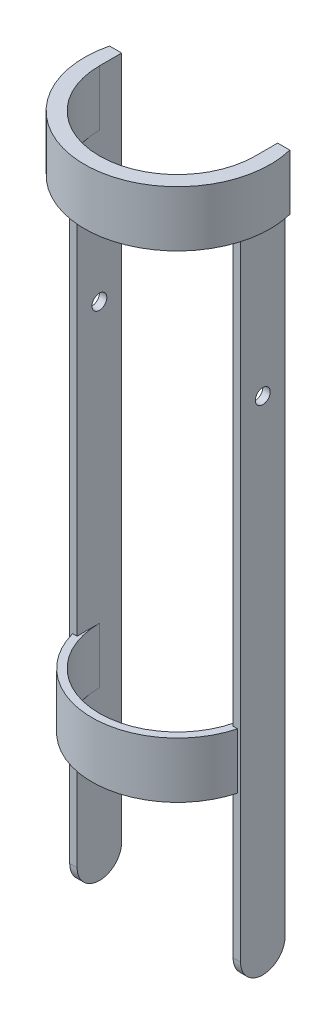
ISO-10303-21;
HEADER;
FILE_DESCRIPTION(('STEP AP214'),'2;1');
FILE_NAME('part.step','',(''),(''),'','','');
FILE_SCHEMA(('AUTOMOTIVE_DESIGN { 1 0 10303 214 1 1 1 1 }'));
ENDSEC;
DATA;
#1=APPLICATION_CONTEXT('core data for automotive mechanical design processes');
#2=APPLICATION_PROTOCOL_DEFINITION('international standard','automotive_design',2000,#1);
#3=PRODUCT_CONTEXT('',#1,'mechanical');
#4=PRODUCT('Part','Part','',(#3));
#5=PRODUCT_RELATED_PRODUCT_CATEGORY('part','',(#4));
#6=PRODUCT_DEFINITION_FORMATION('','',#4);
#7=PRODUCT_DEFINITION_CONTEXT('part definition',#1,'design');
#8=PRODUCT_DEFINITION('design','',#6,#7);
#9=PRODUCT_DEFINITION_SHAPE('','',#8);
#10=(LENGTH_UNIT() NAMED_UNIT(*) SI_UNIT(.MILLI.,.METRE.));
#11=(NAMED_UNIT(*) PLANE_ANGLE_UNIT() SI_UNIT($,.RADIAN.));
#12=(NAMED_UNIT(*) SI_UNIT($,.STERADIAN.) SOLID_ANGLE_UNIT());
#13=UNCERTAINTY_MEASURE_WITH_UNIT(LENGTH_MEASURE(1.E-05),#10,'distance_accuracy_value','');
#14=(GEOMETRIC_REPRESENTATION_CONTEXT(3) GLOBAL_UNCERTAINTY_ASSIGNED_CONTEXT((#13)) GLOBAL_UNIT_ASSIGNED_CONTEXT((#10,
#11,#12)) REPRESENTATION_CONTEXT('',''));
#15=CARTESIAN_POINT('',(0.,0.,0.));
#16=DIRECTION('',(0.,0.,1.));
#17=DIRECTION('',(1.,0.,0.));
#18=AXIS2_PLACEMENT_3D('',#15,#16,#17);
#19=CARTESIAN_POINT('',(-46.,30.,0.));
#20=DIRECTION('',(1.,0.,0.));
#21=DIRECTION('',(0.,0.,-1.));
#22=AXIS2_PLACEMENT_3D('',#19,#20,#21);
#23=PLANE('',#22);
#24=CARTESIAN_POINT('',(-46.,180.,0.));
#25=DIRECTION('',(1.,0.,0.));
#26=DIRECTION('',(0.,0.,-1.));
#27=AXIS2_PLACEMENT_3D('',#24,#25,#26);
#28=CIRCLE('',#27,4.);
#29=CARTESIAN_POINT('',(-46.,180.,-4.));
#30=VERTEX_POINT('',#29);
#31=EDGE_CURVE('E209',#30,#30,#28,.T.);
#32=ORIENTED_EDGE('',*,*,#31,.T.);
#33=EDGE_LOOP('',(#32));
#34=FACE_BOUND('',#33,.T.);
#35=DIRECTION('',(0.,0.,1.));
#36=VECTOR('',#35,1.);
#37=CARTESIAN_POINT('',(-46.,260.,0.));
#38=LINE('',#37,#36);
#39=CARTESIAN_POINT('',(-46.,260.,-12.));
#40=VERTEX_POINT('',#39);
#41=CARTESIAN_POINT('',(-46.,260.,12.));
#42=VERTEX_POINT('',#41);
#43=EDGE_CURVE('E232',#40,#42,#38,.T.);
#44=ORIENTED_EDGE('',*,*,#43,.F.);
#45=DIRECTION('',(0.,-1.,0.));
#46=VECTOR('',#45,1.);
#47=CARTESIAN_POINT('',(-46.,30.,-12.));
#48=LINE('',#47,#46);
#49=CARTESIAN_POINT('',(-46.,-78.,-12.));
#50=VERTEX_POINT('',#49);
#51=EDGE_CURVE('E176',#40,#50,#48,.T.);
#52=ORIENTED_EDGE('',*,*,#51,.T.);
#53=CARTESIAN_POINT('',(-46.,-78.,0.));
#54=DIRECTION('',(-1.,0.,0.));
#55=DIRECTION('',(0.,0.,-1.));
#56=AXIS2_PLACEMENT_3D('',#53,#54,#55);
#57=CIRCLE('',#56,12.);
#58=CARTESIAN_POINT('',(-46.,-78.,12.));
#59=VERTEX_POINT('',#58);
#60=EDGE_CURVE('E273',#50,#59,#57,.T.);
#61=ORIENTED_EDGE('',*,*,#60,.T.);
#62=DIRECTION('',(0.,1.,0.));
#63=VECTOR('',#62,1.);
#64=CARTESIAN_POINT('',(-46.,-90.,12.));
#65=LINE('',#64,#63);
#66=EDGE_CURVE('E302',#59,#42,#65,.T.);
#67=ORIENTED_EDGE('',*,*,#66,.T.);
#68=EDGE_LOOP('',(#44,#52,#61,#67));
#69=FACE_BOUND('',#68,.T.);
#70=ADVANCED_FACE('F39',(#34,#69),#23,.F.);
#71=CARTESIAN_POINT('',(46.,30.,0.));
#72=DIRECTION('',(-1.,0.,0.));
#73=DIRECTION('',(0.,0.,1.));
#74=AXIS2_PLACEMENT_3D('',#71,#72,#73);
#75=PLANE('',#74);
#76=CARTESIAN_POINT('',(46.,180.,0.));
#77=DIRECTION('',(1.,0.,0.));
#78=DIRECTION('',(0.,0.,-1.));
#79=AXIS2_PLACEMENT_3D('',#76,#77,#78);
#80=CIRCLE('',#79,4.);
#81=CARTESIAN_POINT('',(46.,180.,-4.));
#82=VERTEX_POINT('',#81);
#83=EDGE_CURVE('E455',#82,#82,#80,.T.);
#84=ORIENTED_EDGE('',*,*,#83,.F.);
#85=EDGE_LOOP('',(#84));
#86=FACE_BOUND('',#85,.T.);
#87=DIRECTION('',(0.,0.,-1.));
#88=VECTOR('',#87,1.);
#89=CARTESIAN_POINT('',(46.,260.,0.));
#90=LINE('',#89,#88);
#91=CARTESIAN_POINT('',(46.,260.,12.));
#92=VERTEX_POINT('',#91);
#93=CARTESIAN_POINT('',(46.,260.,-12.));
#94=VERTEX_POINT('',#93);
#95=EDGE_CURVE('E225',#92,#94,#90,.T.);
#96=ORIENTED_EDGE('',*,*,#95,.F.);
#97=DIRECTION('',(0.,1.,0.));
#98=VECTOR('',#97,1.);
#99=CARTESIAN_POINT('',(46.,-90.,12.));
#100=LINE('',#99,#98);
#101=CARTESIAN_POINT('',(46.,-78.,12.));
#102=VERTEX_POINT('',#101);
#103=EDGE_CURVE('E293',#102,#92,#100,.T.);
#104=ORIENTED_EDGE('',*,*,#103,.F.);
#105=CARTESIAN_POINT('',(46.,-78.,0.));
#106=DIRECTION('',(-1.,0.,0.));
#107=DIRECTION('',(0.,0.,-1.));
#108=AXIS2_PLACEMENT_3D('',#105,#106,#107);
#109=CIRCLE('',#108,12.);
#110=CARTESIAN_POINT('',(46.,-78.,-12.));
#111=VERTEX_POINT('',#110);
#112=EDGE_CURVE('E272',#111,#102,#109,.T.);
#113=ORIENTED_EDGE('',*,*,#112,.F.);
#114=DIRECTION('',(0.,-1.,0.));
#115=VECTOR('',#114,1.);
#116=CARTESIAN_POINT('',(46.,30.,-12.));
#117=LINE('',#116,#115);
#118=EDGE_CURVE('E339',#94,#111,#117,.T.);
#119=ORIENTED_EDGE('',*,*,#118,.F.);
#120=EDGE_LOOP('',(#96,#104,#113,#119));
#121=FACE_BOUND('',#120,.T.);
#122=ADVANCED_FACE('F398',(#86,#121),#75,.F.);
#123=CARTESIAN_POINT('',(42.,30.,0.));
#124=DIRECTION('',(1.,0.,0.));
#125=DIRECTION('',(0.,0.,-1.));
#126=AXIS2_PLACEMENT_3D('',#123,#124,#125);
#127=PLANE('',#126);
#128=CARTESIAN_POINT('',(42.,180.,0.));
#129=DIRECTION('',(1.,0.,0.));
#130=DIRECTION('',(0.,0.,-1.));
#131=AXIS2_PLACEMENT_3D('',#128,#129,#130);
#132=CIRCLE('',#131,4.);
#133=CARTESIAN_POINT('',(42.,180.,-4.));
#134=VERTEX_POINT('',#133);
#135=EDGE_CURVE('E454',#134,#134,#132,.T.);
#136=ORIENTED_EDGE('',*,*,#135,.T.);
#137=EDGE_LOOP('',(#136));
#138=FACE_BOUND('',#137,.T.);
#139=DIRECTION('',(0.,0.,1.));
#140=VECTOR('',#139,1.);
#141=CARTESIAN_POINT('',(42.,260.,0.));
#142=LINE('',#141,#140);
#143=CARTESIAN_POINT('',(42.,260.,0.));
#144=VERTEX_POINT('',#143);
#145=CARTESIAN_POINT('',(42.,260.,12.));
#146=VERTEX_POINT('',#145);
#147=EDGE_CURVE('E216',#144,#146,#142,.T.);
#148=ORIENTED_EDGE('',*,*,#147,.F.);
#149=DIRECTION('',(0.,1.,0.));
#150=VECTOR('',#149,1.);
#151=CARTESIAN_POINT('',(42.,260.,0.));
#152=LINE('',#151,#150);
#153=CARTESIAN_POINT('',(42.,290.,0.));
#154=VERTEX_POINT('',#153);
#155=EDGE_CURVE('E217',#144,#154,#152,.T.);
#156=ORIENTED_EDGE('',*,*,#155,.T.);
#157=DIRECTION('',(0.,0.,1.));
#158=VECTOR('',#157,1.);
#159=CARTESIAN_POINT('',(42.,290.,-12.));
#160=LINE('',#159,#158);
#161=CARTESIAN_POINT('',(42.,290.,-12.));
#162=VERTEX_POINT('',#161);
#163=EDGE_CURVE('E258',#162,#154,#160,.T.);
#164=ORIENTED_EDGE('',*,*,#163,.F.);
#165=DIRECTION('',(0.,-1.,0.));
#166=VECTOR('',#165,1.);
#167=CARTESIAN_POINT('',(42.,30.,-12.));
#168=LINE('',#167,#166);
#169=CARTESIAN_POINT('',(42.,-78.,-12.));
#170=VERTEX_POINT('',#169);
#171=EDGE_CURVE('E336',#162,#170,#168,.T.);
#172=ORIENTED_EDGE('',*,*,#171,.T.);
#173=CARTESIAN_POINT('',(42.,-78.,0.));
#174=DIRECTION('',(1.,0.,0.));
#175=DIRECTION('',(0.,0.,-1.));
#176=AXIS2_PLACEMENT_3D('',#173,#174,#175);
#177=CIRCLE('',#176,12.);
#178=CARTESIAN_POINT('',(42.,-78.,12.));
#179=VERTEX_POINT('',#178);
#180=EDGE_CURVE('E283',#170,#179,#177,.F.);
#181=ORIENTED_EDGE('',*,*,#180,.T.);
#182=DIRECTION('',(0.,1.,0.));
#183=VECTOR('',#182,1.);
#184=CARTESIAN_POINT('',(42.,-90.,12.));
#185=LINE('',#184,#183);
#186=CARTESIAN_POINT('',(42.,0.,12.));
#187=VERTEX_POINT('',#186);
#188=EDGE_CURVE('E292',#179,#187,#185,.T.);
#189=ORIENTED_EDGE('',*,*,#188,.T.);
#190=DIRECTION('',(0.,0.,1.));
#191=VECTOR('',#190,1.);
#192=CARTESIAN_POINT('',(42.,0.,0.));
#193=LINE('',#192,#191);
#194=CARTESIAN_POINT('',(42.,0.,0.));
#195=VERTEX_POINT('',#194);
#196=EDGE_CURVE('E354',#195,#187,#193,.T.);
#197=ORIENTED_EDGE('',*,*,#196,.F.);
#198=DIRECTION('',(0.,-1.,0.));
#199=VECTOR('',#198,1.);
#200=CARTESIAN_POINT('',(42.,30.,0.));
#201=LINE('',#200,#199);
#202=CARTESIAN_POINT('',(42.,30.,0.));
#203=VERTEX_POINT('',#202);
#204=EDGE_CURVE('E332',#203,#195,#201,.T.);
#205=ORIENTED_EDGE('',*,*,#204,.F.);
#206=DIRECTION('',(0.,0.,1.));
#207=VECTOR('',#206,1.);
#208=CARTESIAN_POINT('',(42.,30.,-12.));
#209=LINE('',#208,#207);
#210=CARTESIAN_POINT('',(42.,30.,12.));
#211=VERTEX_POINT('',#210);
#212=EDGE_CURVE('E49',#203,#211,#209,.T.);
#213=ORIENTED_EDGE('',*,*,#212,.T.);
#214=DIRECTION('',(0.,-1.,0.));
#215=VECTOR('',#214,1.);
#216=CARTESIAN_POINT('',(42.,290.,12.));
#217=LINE('',#216,#215);
#218=EDGE_CURVE('E262',#146,#211,#217,.T.);
#219=ORIENTED_EDGE('',*,*,#218,.F.);
#220=EDGE_LOOP('',(#148,#156,#164,#172,#181,#189,#197,#205,#213,#219));
#221=FACE_BOUND('',#220,.T.);
#222=ADVANCED_FACE('F386',(#138,#221),#127,.F.);
#223=CARTESIAN_POINT('',(-46.,-90.,12.));
#224=DIRECTION('',(0.,0.,1.));
#225=DIRECTION('',(1.,0.,0.));
#226=AXIS2_PLACEMENT_3D('',#223,#224,#225);
#227=PLANE('',#226);
#228=DIRECTION('',(0.,-1.,0.));
#229=VECTOR('',#228,1.);
#230=CARTESIAN_POINT('',(-42.,290.,12.));
#231=LINE('',#230,#229);
#232=CARTESIAN_POINT('',(-42.,260.,12.));
#233=VERTEX_POINT('',#232);
#234=CARTESIAN_POINT('',(-42.,30.,12.));
#235=VERTEX_POINT('',#234);
#236=EDGE_CURVE('E56',#233,#235,#231,.T.);
#237=ORIENTED_EDGE('',*,*,#236,.F.);
#238=DIRECTION('',(-1.,0.,0.));
#239=VECTOR('',#238,1.);
#240=CARTESIAN_POINT('',(-46.,260.,12.));
#241=LINE('',#240,#239);
#242=EDGE_CURVE('E228',#233,#42,#241,.T.);
#243=ORIENTED_EDGE('',*,*,#242,.T.);
#244=ORIENTED_EDGE('',*,*,#66,.F.);
#245=DIRECTION('',(1.,0.,0.));
#246=VECTOR('',#245,1.);
#247=CARTESIAN_POINT('',(-46.,-78.,12.));
#248=LINE('',#247,#246);
#249=CARTESIAN_POINT('',(-42.,-78.,12.));
#250=VERTEX_POINT('',#249);
#251=EDGE_CURVE('E285',#59,#250,#248,.T.);
#252=ORIENTED_EDGE('',*,*,#251,.T.);
#253=DIRECTION('',(0.,1.,0.));
#254=VECTOR('',#253,1.);
#255=CARTESIAN_POINT('',(-42.,-90.,12.));
#256=LINE('',#255,#254);
#257=CARTESIAN_POINT('',(-42.,0.,12.));
#258=VERTEX_POINT('',#257);
#259=EDGE_CURVE('E303',#250,#258,#256,.T.);
#260=ORIENTED_EDGE('',*,*,#259,.T.);
#261=DIRECTION('',(1.,0.,0.));
#262=VECTOR('',#261,1.);
#263=CARTESIAN_POINT('',(0.,0.,12.));
#264=LINE('',#263,#262);
#265=CARTESIAN_POINT('',(-44.407206622349,0.,12.));
#266=VERTEX_POINT('',#265);
#267=EDGE_CURVE('E347',#266,#258,#264,.T.);
#268=ORIENTED_EDGE('',*,*,#267,.F.);
#269=DIRECTION('',(0.,-1.,0.));
#270=VECTOR('',#269,1.);
#271=CARTESIAN_POINT('',(-44.407206622349,30.,12.));
#272=LINE('',#271,#270);
#273=CARTESIAN_POINT('',(-44.407206622349,30.,12.));
#274=VERTEX_POINT('',#273);
#275=EDGE_CURVE('E306',#274,#266,#272,.T.);
#276=ORIENTED_EDGE('',*,*,#275,.F.);
#277=DIRECTION('',(1.,0.,0.));
#278=VECTOR('',#277,1.);
#279=CARTESIAN_POINT('',(-46.,30.,12.));
#280=LINE('',#279,#278);
#281=EDGE_CURVE('E238',#274,#235,#280,.T.);
#282=ORIENTED_EDGE('',*,*,#281,.T.);
#283=EDGE_LOOP('',(#237,#243,#244,#252,#260,#268,#276,#282));
#284=FACE_BOUND('',#283,.T.);
#285=ADVANCED_FACE('F372',(#284),#227,.T.);
#286=CARTESIAN_POINT('',(46.,-90.,12.));
#287=DIRECTION('',(0.,0.,1.));
#288=DIRECTION('',(1.,0.,0.));
#289=AXIS2_PLACEMENT_3D('',#286,#287,#288);
#290=PLANE('',#289);
#291=ORIENTED_EDGE('',*,*,#103,.T.);
#292=DIRECTION('',(-1.,0.,0.));
#293=VECTOR('',#292,1.);
#294=CARTESIAN_POINT('',(46.,260.,12.));
#295=LINE('',#294,#293);
#296=EDGE_CURVE('E11',#92,#146,#295,.T.);
#297=ORIENTED_EDGE('',*,*,#296,.T.);
#298=ORIENTED_EDGE('',*,*,#218,.T.);
#299=DIRECTION('',(1.,0.,0.));
#300=VECTOR('',#299,1.);
#301=CARTESIAN_POINT('',(46.,30.,12.));
#302=LINE('',#301,#300);
#303=CARTESIAN_POINT('',(44.407206622349,30.,12.));
#304=VERTEX_POINT('',#303);
#305=EDGE_CURVE('E253',#211,#304,#302,.T.);
#306=ORIENTED_EDGE('',*,*,#305,.T.);
#307=DIRECTION('',(0.,-1.,0.));
#308=VECTOR('',#307,1.);
#309=CARTESIAN_POINT('',(44.407206622349,30.,12.));
#310=LINE('',#309,#308);
#311=CARTESIAN_POINT('',(44.407206622349,0.,12.));
#312=VERTEX_POINT('',#311);
#313=EDGE_CURVE('E297',#312,#304,#310,.F.);
#314=ORIENTED_EDGE('',*,*,#313,.F.);
#315=DIRECTION('',(1.,0.,0.));
#316=VECTOR('',#315,1.);
#317=CARTESIAN_POINT('',(0.,0.,12.));
#318=LINE('',#317,#316);
#319=EDGE_CURVE('E266',#187,#312,#318,.T.);
#320=ORIENTED_EDGE('',*,*,#319,.F.);
#321=ORIENTED_EDGE('',*,*,#188,.F.);
#322=EDGE_CURVE('E277',#179,#102,#248,.T.);
#323=ORIENTED_EDGE('',*,*,#322,.T.);
#324=EDGE_LOOP('',(#291,#297,#298,#306,#314,#320,#321,#323));
#325=FACE_BOUND('',#324,.T.);
#326=ADVANCED_FACE('F391',(#325),#290,.T.);
#327=CARTESIAN_POINT('',(0.,30.,0.));
#328=DIRECTION('',(0.,1.,0.));
#329=DIRECTION('',(0.,0.,1.));
#330=AXIS2_PLACEMENT_3D('',#327,#328,#329);
#331=PLANE('',#330);
#332=DIRECTION('',(0.,0.,-1.));
#333=VECTOR('',#332,1.);
#334=CARTESIAN_POINT('',(-42.,30.,-12.));
#335=LINE('',#334,#333);
#336=CARTESIAN_POINT('',(-42.,30.,0.));
#337=VERTEX_POINT('',#336);
#338=EDGE_CURVE('E243',#235,#337,#335,.T.);
#339=ORIENTED_EDGE('',*,*,#338,.F.);
#340=ORIENTED_EDGE('',*,*,#281,.F.);
#341=CARTESIAN_POINT('',(0.,30.,0.));
#342=DIRECTION('',(0.,1.,0.));
#343=DIRECTION('',(0.,0.,1.));
#344=AXIS2_PLACEMENT_3D('',#341,#342,#343);
#345=CIRCLE('',#344,46.);
#346=EDGE_CURVE('E314',#274,#304,#345,.T.);
#347=ORIENTED_EDGE('',*,*,#346,.T.);
#348=ORIENTED_EDGE('',*,*,#305,.F.);
#349=ORIENTED_EDGE('',*,*,#212,.F.);
#350=CARTESIAN_POINT('',(0.,30.,0.));
#351=DIRECTION('',(0.,-1.,0.));
#352=DIRECTION('',(0.,0.,1.));
#353=AXIS2_PLACEMENT_3D('',#350,#351,#352);
#354=CIRCLE('',#353,42.);
#355=EDGE_CURVE('E318',#203,#337,#354,.T.);
#356=ORIENTED_EDGE('',*,*,#355,.T.);
#357=EDGE_LOOP('',(#339,#340,#347,#348,#349,#356));
#358=FACE_BOUND('',#357,.T.);
#359=ADVANCED_FACE('F374',(#358),#331,.T.);
#360=CARTESIAN_POINT('',(-42.,30.,0.));
#361=DIRECTION('',(-1.,0.,0.));
#362=DIRECTION('',(0.,0.,1.));
#363=AXIS2_PLACEMENT_3D('',#360,#361,#362);
#364=PLANE('',#363);
#365=CARTESIAN_POINT('',(-42.,180.,0.));
#366=DIRECTION('',(-1.,0.,0.));
#367=DIRECTION('',(0.,0.,1.));
#368=AXIS2_PLACEMENT_3D('',#365,#366,#367);
#369=CIRCLE('',#368,4.);
#370=CARTESIAN_POINT('',(-42.,180.,4.));
#371=VERTEX_POINT('',#370);
#372=EDGE_CURVE('E43',#371,#371,#369,.T.);
#373=ORIENTED_EDGE('',*,*,#372,.T.);
#374=EDGE_LOOP('',(#373));
#375=FACE_BOUND('',#374,.T.);
#376=DIRECTION('',(0.,0.,-1.));
#377=VECTOR('',#376,1.);
#378=CARTESIAN_POINT('',(-42.,290.,-12.));
#379=LINE('',#378,#377);
#380=CARTESIAN_POINT('',(-42.,290.,2.90712674184614E-13));
#381=VERTEX_POINT('',#380);
#382=CARTESIAN_POINT('',(-42.,290.,-12.));
#383=VERTEX_POINT('',#382);
#384=EDGE_CURVE('E239',#381,#383,#379,.T.);
#385=ORIENTED_EDGE('',*,*,#384,.F.);
#386=DIRECTION('',(0.,1.,0.));
#387=VECTOR('',#386,1.);
#388=CARTESIAN_POINT('',(-42.,260.,2.90712674184614E-13));
#389=LINE('',#388,#387);
#390=CARTESIAN_POINT('',(-42.,260.,2.90712674184614E-13));
#391=VERTEX_POINT('',#390);
#392=EDGE_CURVE('E213',#391,#381,#389,.T.);
#393=ORIENTED_EDGE('',*,*,#392,.F.);
#394=DIRECTION('',(0.,0.,-1.));
#395=VECTOR('',#394,1.);
#396=CARTESIAN_POINT('',(-42.,260.,0.));
#397=LINE('',#396,#395);
#398=EDGE_CURVE('E235',#233,#391,#397,.T.);
#399=ORIENTED_EDGE('',*,*,#398,.F.);
#400=ORIENTED_EDGE('',*,*,#236,.T.);
#401=ORIENTED_EDGE('',*,*,#338,.T.);
#402=DIRECTION('',(0.,-1.,0.));
#403=VECTOR('',#402,1.);
#404=CARTESIAN_POINT('',(-42.,30.,0.));
#405=LINE('',#404,#403);
#406=CARTESIAN_POINT('',(-42.,0.,0.));
#407=VERTEX_POINT('',#406);
#408=EDGE_CURVE('E322',#337,#407,#405,.T.);
#409=ORIENTED_EDGE('',*,*,#408,.T.);
#410=DIRECTION('',(0.,0.,-1.));
#411=VECTOR('',#410,1.);
#412=CARTESIAN_POINT('',(-42.,0.,0.));
#413=LINE('',#412,#411);
#414=EDGE_CURVE('E351',#258,#407,#413,.T.);
#415=ORIENTED_EDGE('',*,*,#414,.F.);
#416=ORIENTED_EDGE('',*,*,#259,.F.);
#417=CARTESIAN_POINT('',(-42.,-78.,0.));
#418=DIRECTION('',(-1.,0.,0.));
#419=DIRECTION('',(0.,0.,1.));
#420=AXIS2_PLACEMENT_3D('',#417,#418,#419);
#421=CIRCLE('',#420,12.);
#422=CARTESIAN_POINT('',(-42.,-78.,-12.));
#423=VERTEX_POINT('',#422);
#424=EDGE_CURVE('E64',#250,#423,#421,.F.);
#425=ORIENTED_EDGE('',*,*,#424,.T.);
#426=DIRECTION('',(0.,-1.,0.));
#427=VECTOR('',#426,1.);
#428=CARTESIAN_POINT('',(-42.,30.,-12.));
#429=LINE('',#428,#427);
#430=EDGE_CURVE('E344',#383,#423,#429,.T.);
#431=ORIENTED_EDGE('',*,*,#430,.F.);
#432=EDGE_LOOP('',(#385,#393,#399,#400,#401,#409,#415,#416,#425,#431));
#433=FACE_BOUND('',#432,.T.);
#434=ADVANCED_FACE('F41',(#375,#433),#364,.F.);
#435=CARTESIAN_POINT('',(-46.,30.,-12.));
#436=DIRECTION('',(0.,0.,1.));
#437=DIRECTION('',(1.,0.,0.));
#438=AXIS2_PLACEMENT_3D('',#435,#436,#437);
#439=PLANE('',#438);
#440=ORIENTED_EDGE('',*,*,#430,.T.);
#441=DIRECTION('',(1.,0.,0.));
#442=VECTOR('',#441,1.);
#443=CARTESIAN_POINT('',(-46.,-78.,-12.));
#444=LINE('',#443,#442);
#445=EDGE_CURVE('E280',#50,#423,#444,.T.);
#446=ORIENTED_EDGE('',*,*,#445,.F.);
#447=ORIENTED_EDGE('',*,*,#51,.F.);
#448=DIRECTION('',(-1.,0.,0.));
#449=VECTOR('',#448,1.);
#450=CARTESIAN_POINT('',(-48.5386443980464,260.,-12.));
#451=LINE('',#450,#449);
#452=CARTESIAN_POINT('',(-48.5386443980464,260.,-12.));
#453=VERTEX_POINT('',#452);
#454=EDGE_CURVE('E169',#40,#453,#451,.T.);
#455=ORIENTED_EDGE('',*,*,#454,.T.);
#456=DIRECTION('',(0.,1.,0.));
#457=VECTOR('',#456,1.);
#458=CARTESIAN_POINT('',(-48.5386443980464,260.,-12.));
#459=LINE('',#458,#457);
#460=CARTESIAN_POINT('',(-48.5386443980464,290.,-12.));
#461=VERTEX_POINT('',#460);
#462=EDGE_CURVE('E173',#453,#461,#459,.T.);
#463=ORIENTED_EDGE('',*,*,#462,.T.);
#464=DIRECTION('',(-1.,0.,0.));
#465=VECTOR('',#464,1.);
#466=CARTESIAN_POINT('',(-46.,290.,-12.));
#467=LINE('',#466,#465);
#468=EDGE_CURVE('E242',#383,#461,#467,.T.);
#469=ORIENTED_EDGE('',*,*,#468,.F.);
#470=EDGE_LOOP('',(#440,#446,#447,#455,#463,#469));
#471=FACE_BOUND('',#470,.T.);
#472=ADVANCED_FACE('F171',(#471),#439,.F.);
#473=CARTESIAN_POINT('',(0.,30.,0.));
#474=DIRECTION('',(0.,-1.,0.));
#475=DIRECTION('',(0.,0.,-1.));
#476=AXIS2_PLACEMENT_3D('',#473,#474,#475);
#477=CYLINDRICAL_SURFACE('',#476,46.);
#478=CARTESIAN_POINT('',(0.,0.,0.));
#479=DIRECTION('',(0.,1.,0.));
#480=DIRECTION('',(0.,0.,1.));
#481=AXIS2_PLACEMENT_3D('',#478,#479,#480);
#482=CIRCLE('',#481,46.);
#483=EDGE_CURVE('E313',#266,#312,#482,.T.);
#484=ORIENTED_EDGE('',*,*,#483,.T.);
#485=ORIENTED_EDGE('',*,*,#313,.T.);
#486=ORIENTED_EDGE('',*,*,#346,.F.);
#487=ORIENTED_EDGE('',*,*,#275,.T.);
#488=EDGE_LOOP('',(#484,#485,#486,#487));
#489=FACE_BOUND('',#488,.T.);
#490=ADVANCED_FACE('F368',(#489),#477,.T.);
#491=CARTESIAN_POINT('',(46.,30.,-12.));
#492=DIRECTION('',(0.,0.,1.));
#493=DIRECTION('',(1.,0.,0.));
#494=AXIS2_PLACEMENT_3D('',#491,#492,#493);
#495=PLANE('',#494);
#496=DIRECTION('',(-1.,0.,0.));
#497=VECTOR('',#496,1.);
#498=CARTESIAN_POINT('',(46.,290.,-12.));
#499=LINE('',#498,#497);
#500=CARTESIAN_POINT('',(48.5386443980464,290.,-12.));
#501=VERTEX_POINT('',#500);
#502=EDGE_CURVE('E254',#501,#162,#499,.T.);
#503=ORIENTED_EDGE('',*,*,#502,.F.);
#504=DIRECTION('',(0.,1.,0.));
#505=VECTOR('',#504,1.);
#506=CARTESIAN_POINT('',(48.5386443980464,260.,-12.));
#507=LINE('',#506,#505);
#508=CARTESIAN_POINT('',(48.5386443980464,260.,-12.));
#509=VERTEX_POINT('',#508);
#510=EDGE_CURVE('E191',#509,#501,#507,.T.);
#511=ORIENTED_EDGE('',*,*,#510,.F.);
#512=DIRECTION('',(-1.,0.,0.));
#513=VECTOR('',#512,1.);
#514=CARTESIAN_POINT('',(42.,260.,-12.));
#515=LINE('',#514,#513);
#516=EDGE_CURVE('E197',#509,#94,#515,.T.);
#517=ORIENTED_EDGE('',*,*,#516,.T.);
#518=ORIENTED_EDGE('',*,*,#118,.T.);
#519=EDGE_CURVE('E284',#170,#111,#444,.T.);
#520=ORIENTED_EDGE('',*,*,#519,.F.);
#521=ORIENTED_EDGE('',*,*,#171,.F.);
#522=EDGE_LOOP('',(#503,#511,#517,#518,#520,#521));
#523=FACE_BOUND('',#522,.T.);
#524=ADVANCED_FACE('F401',(#523),#495,.F.);
#525=CARTESIAN_POINT('',(0.,30.,0.));
#526=DIRECTION('',(0.,-1.,0.));
#527=DIRECTION('',(0.,0.,-1.));
#528=AXIS2_PLACEMENT_3D('',#525,#526,#527);
#529=CYLINDRICAL_SURFACE('',#528,42.);
#530=CARTESIAN_POINT('',(0.,0.,0.));
#531=DIRECTION('',(0.,-1.,0.));
#532=DIRECTION('',(0.,0.,1.));
#533=AXIS2_PLACEMENT_3D('',#530,#531,#532);
#534=CIRCLE('',#533,42.);
#535=EDGE_CURVE('E319',#195,#407,#534,.T.);
#536=ORIENTED_EDGE('',*,*,#535,.T.);
#537=ORIENTED_EDGE('',*,*,#408,.F.);
#538=ORIENTED_EDGE('',*,*,#355,.F.);
#539=ORIENTED_EDGE('',*,*,#204,.T.);
#540=EDGE_LOOP('',(#536,#537,#538,#539));
#541=FACE_BOUND('',#540,.T.);
#542=ADVANCED_FACE('F382',(#541),#529,.F.);
#543=CARTESIAN_POINT('',(0.,0.,0.));
#544=DIRECTION('',(0.,1.,0.));
#545=DIRECTION('',(0.,0.,1.));
#546=AXIS2_PLACEMENT_3D('',#543,#544,#545);
#547=PLANE('',#546);
#548=ORIENTED_EDGE('',*,*,#196,.T.);
#549=ORIENTED_EDGE('',*,*,#319,.T.);
#550=ORIENTED_EDGE('',*,*,#483,.F.);
#551=ORIENTED_EDGE('',*,*,#267,.T.);
#552=ORIENTED_EDGE('',*,*,#414,.T.);
#553=ORIENTED_EDGE('',*,*,#535,.F.);
#554=EDGE_LOOP('',(#548,#549,#550,#551,#552,#553));
#555=FACE_BOUND('',#554,.T.);
#556=ADVANCED_FACE('F363',(#555),#547,.F.);
#557=CARTESIAN_POINT('',(-46.,-78.,0.));
#558=DIRECTION('',(1.,0.,0.));
#559=DIRECTION('',(0.,0.,-1.));
#560=AXIS2_PLACEMENT_3D('',#557,#558,#559);
#561=CYLINDRICAL_SURFACE('',#560,12.);
#562=ORIENTED_EDGE('',*,*,#519,.T.);
#563=ORIENTED_EDGE('',*,*,#112,.T.);
#564=ORIENTED_EDGE('',*,*,#322,.F.);
#565=ORIENTED_EDGE('',*,*,#180,.F.);
#566=EDGE_LOOP('',(#562,#563,#564,#565));
#567=FACE_BOUND('',#566,.T.);
#568=ADVANCED_FACE('F416',(#567),#561,.T.);
#569=ORIENTED_EDGE('',*,*,#251,.F.);
#570=ORIENTED_EDGE('',*,*,#60,.F.);
#571=ORIENTED_EDGE('',*,*,#445,.T.);
#572=ORIENTED_EDGE('',*,*,#424,.F.);
#573=EDGE_LOOP('',(#569,#570,#571,#572));
#574=FACE_BOUND('',#573,.T.);
#575=ADVANCED_FACE('F409',(#574),#561,.T.);
#576=CARTESIAN_POINT('',(0.,290.,0.));
#577=DIRECTION('',(0.,-1.,0.));
#578=DIRECTION('',(0.,0.,-1.));
#579=AXIS2_PLACEMENT_3D('',#576,#577,#578);
#580=PLANE('',#579);
#581=CARTESIAN_POINT('',(0.,290.,0.));
#582=DIRECTION('',(0.,-1.,0.));
#583=DIRECTION('',(0.,0.,1.));
#584=AXIS2_PLACEMENT_3D('',#581,#582,#583);
#585=CIRCLE('',#584,42.);
#586=EDGE_CURVE('E182',#154,#381,#585,.T.);
#587=ORIENTED_EDGE('',*,*,#586,.T.);
#588=ORIENTED_EDGE('',*,*,#384,.T.);
#589=ORIENTED_EDGE('',*,*,#468,.T.);
#590=CARTESIAN_POINT('',(0.,290.,0.));
#591=DIRECTION('',(0.,1.,0.));
#592=DIRECTION('',(0.,0.,1.));
#593=AXIS2_PLACEMENT_3D('',#590,#591,#592);
#594=CIRCLE('',#593,50.);
#595=EDGE_CURVE('E189',#461,#501,#594,.T.);
#596=ORIENTED_EDGE('',*,*,#595,.T.);
#597=ORIENTED_EDGE('',*,*,#502,.T.);
#598=ORIENTED_EDGE('',*,*,#163,.T.);
#599=EDGE_LOOP('',(#587,#588,#589,#596,#597,#598));
#600=FACE_BOUND('',#599,.T.);
#601=ADVANCED_FACE('F405',(#600),#580,.F.);
#602=CARTESIAN_POINT('',(0.,260.,0.));
#603=DIRECTION('',(0.,1.,0.));
#604=DIRECTION('',(0.,0.,1.));
#605=AXIS2_PLACEMENT_3D('',#602,#603,#604);
#606=PLANE('',#605);
#607=ORIENTED_EDGE('',*,*,#242,.F.);
#608=ORIENTED_EDGE('',*,*,#398,.T.);
#609=CARTESIAN_POINT('',(0.,260.,0.));
#610=DIRECTION('',(0.,-1.,0.));
#611=DIRECTION('',(0.,0.,1.));
#612=AXIS2_PLACEMENT_3D('',#609,#610,#611);
#613=CIRCLE('',#612,42.);
#614=EDGE_CURVE('E192',#144,#391,#613,.T.);
#615=ORIENTED_EDGE('',*,*,#614,.F.);
#616=ORIENTED_EDGE('',*,*,#147,.T.);
#617=ORIENTED_EDGE('',*,*,#296,.F.);
#618=ORIENTED_EDGE('',*,*,#95,.T.);
#619=ORIENTED_EDGE('',*,*,#516,.F.);
#620=CARTESIAN_POINT('',(0.,260.,0.));
#621=DIRECTION('',(0.,1.,0.));
#622=DIRECTION('',(0.,0.,1.));
#623=AXIS2_PLACEMENT_3D('',#620,#621,#622);
#624=CIRCLE('',#623,50.);
#625=EDGE_CURVE('E181',#453,#509,#624,.T.);
#626=ORIENTED_EDGE('',*,*,#625,.F.);
#627=ORIENTED_EDGE('',*,*,#454,.F.);
#628=ORIENTED_EDGE('',*,*,#43,.T.);
#629=EDGE_LOOP('',(#607,#608,#615,#616,#617,#618,#619,#626,#627,#628));
#630=FACE_BOUND('',#629,.T.);
#631=ADVANCED_FACE('F195',(#630),#606,.F.);
#632=CARTESIAN_POINT('',(0.,260.,0.));
#633=DIRECTION('',(0.,1.,0.));
#634=DIRECTION('',(0.,0.,1.));
#635=AXIS2_PLACEMENT_3D('',#632,#633,#634);
#636=CYLINDRICAL_SURFACE('',#635,42.);
#637=ORIENTED_EDGE('',*,*,#586,.F.);
#638=ORIENTED_EDGE('',*,*,#155,.F.);
#639=ORIENTED_EDGE('',*,*,#614,.T.);
#640=ORIENTED_EDGE('',*,*,#392,.T.);
#641=EDGE_LOOP('',(#637,#638,#639,#640));
#642=FACE_BOUND('',#641,.T.);
#643=ADVANCED_FACE('F415',(#642),#636,.F.);
#644=CARTESIAN_POINT('',(0.,260.,0.));
#645=DIRECTION('',(0.,1.,0.));
#646=DIRECTION('',(0.,0.,1.));
#647=AXIS2_PLACEMENT_3D('',#644,#645,#646);
#648=CYLINDRICAL_SURFACE('',#647,50.);
#649=ORIENTED_EDGE('',*,*,#595,.F.);
#650=ORIENTED_EDGE('',*,*,#462,.F.);
#651=ORIENTED_EDGE('',*,*,#625,.T.);
#652=ORIENTED_EDGE('',*,*,#510,.T.);
#653=EDGE_LOOP('',(#649,#650,#651,#652));
#654=FACE_BOUND('',#653,.T.);
#655=ADVANCED_FACE('F186',(#654),#648,.T.);
#656=CARTESIAN_POINT('',(-50.,180.,0.));
#657=DIRECTION('',(1.,0.,0.));
#658=DIRECTION('',(0.,0.,-1.));
#659=AXIS2_PLACEMENT_3D('',#656,#657,#658);
#660=CYLINDRICAL_SURFACE('',#659,4.);
#661=ORIENTED_EDGE('',*,*,#372,.F.);
#662=EDGE_LOOP('',(#661));
#663=FACE_BOUND('',#662,.T.);
#664=ORIENTED_EDGE('',*,*,#31,.F.);
#665=EDGE_LOOP('',(#664));
#666=FACE_BOUND('',#665,.T.);
#667=ADVANCED_FACE('F467',(#663,#666),#660,.F.);
#668=ORIENTED_EDGE('',*,*,#83,.T.);
#669=EDGE_LOOP('',(#668));
#670=FACE_BOUND('',#669,.T.);
#671=ORIENTED_EDGE('',*,*,#135,.F.);
#672=EDGE_LOOP('',(#671));
#673=FACE_BOUND('',#672,.T.);
#674=ADVANCED_FACE('F469',(#670,#673),#660,.F.);
#675=CLOSED_SHELL('',(#70,#122,#222,#285,#326,#359,#434,#472,#490,#524,#542,#556,#568,#575,#601,
#631,#643,#655,#667,#674));
#676=MANIFOLD_SOLID_BREP('B2',#675);
#677=ADVANCED_BREP_SHAPE_REPRESENTATION('',(#18,#676),#14);
#678=SHAPE_DEFINITION_REPRESENTATION(#9,#677);
ENDSEC;
END-ISO-10303-21;
